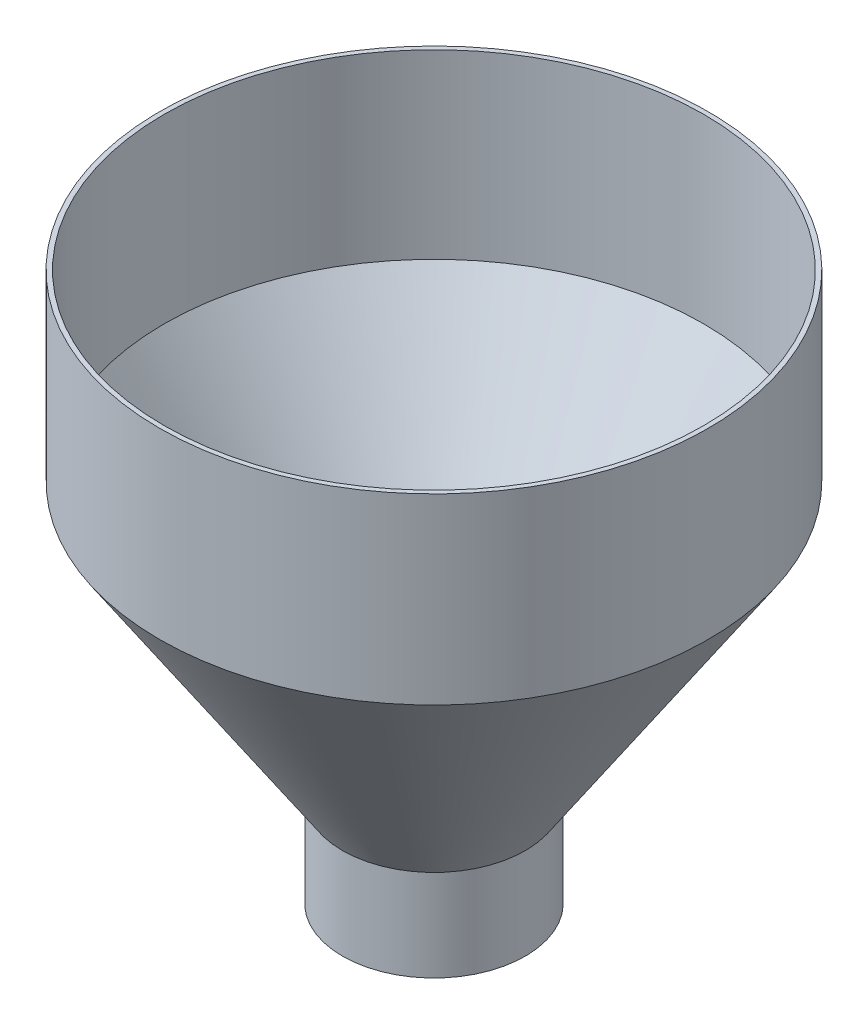
ISO-10303-21;
HEADER;
FILE_DESCRIPTION(('STEP AP214'),'2;1');
FILE_NAME('part.step','',(''),(''),'','','');
FILE_SCHEMA(('AUTOMOTIVE_DESIGN { 1 0 10303 214 1 1 1 1 }'));
ENDSEC;
DATA;
#1=APPLICATION_CONTEXT('core data for automotive mechanical design processes');
#2=APPLICATION_PROTOCOL_DEFINITION('international standard','automotive_design',2000,#1);
#3=PRODUCT_CONTEXT('',#1,'mechanical');
#4=PRODUCT('Part','Part','',(#3));
#5=PRODUCT_RELATED_PRODUCT_CATEGORY('part','',(#4));
#6=PRODUCT_DEFINITION_FORMATION('','',#4);
#7=PRODUCT_DEFINITION_CONTEXT('part definition',#1,'design');
#8=PRODUCT_DEFINITION('design','',#6,#7);
#9=PRODUCT_DEFINITION_SHAPE('','',#8);
#10=(LENGTH_UNIT() NAMED_UNIT(*) SI_UNIT(.MILLI.,.METRE.));
#11=(NAMED_UNIT(*) PLANE_ANGLE_UNIT() SI_UNIT($,.RADIAN.));
#12=(NAMED_UNIT(*) SI_UNIT($,.STERADIAN.) SOLID_ANGLE_UNIT());
#13=UNCERTAINTY_MEASURE_WITH_UNIT(LENGTH_MEASURE(1.E-05),#10,'distance_accuracy_value','');
#14=(GEOMETRIC_REPRESENTATION_CONTEXT(3) GLOBAL_UNCERTAINTY_ASSIGNED_CONTEXT((#13)) GLOBAL_UNIT_ASSIGNED_CONTEXT((#10,
#11,#12)) REPRESENTATION_CONTEXT('',''));
#15=CARTESIAN_POINT('',(0.,0.,0.));
#16=DIRECTION('',(0.,0.,1.));
#17=DIRECTION('',(1.,0.,0.));
#18=AXIS2_PLACEMENT_3D('',#15,#16,#17);
#19=CARTESIAN_POINT('',(0.,240.,0.));
#20=DIRECTION('',(0.,1.,0.));
#21=DIRECTION('',(0.,0.,1.));
#22=AXIS2_PLACEMENT_3D('',#19,#20,#21);
#23=PLANE('',#22);
#24=CARTESIAN_POINT('',(0.,240.,0.));
#25=DIRECTION('',(0.,1.,0.));
#26=DIRECTION('',(0.,0.,1.));
#27=AXIS2_PLACEMENT_3D('',#24,#25,#26);
#28=CIRCLE('',#27,118.);
#29=CARTESIAN_POINT('',(0.,240.,118.));
#30=VERTEX_POINT('',#29);
#31=EDGE_CURVE('E56',#30,#30,#28,.T.);
#32=ORIENTED_EDGE('',*,*,#31,.F.);
#33=EDGE_LOOP('',(#32));
#34=FACE_BOUND('',#33,.T.);
#35=CARTESIAN_POINT('',(0.,240.,0.));
#36=DIRECTION('',(0.,1.,0.));
#37=DIRECTION('',(0.,0.,1.));
#38=AXIS2_PLACEMENT_3D('',#35,#36,#37);
#39=CIRCLE('',#38,120.);
#40=CARTESIAN_POINT('',(0.,240.,120.));
#41=VERTEX_POINT('',#40);
#42=EDGE_CURVE('E10',#41,#41,#39,.T.);
#43=ORIENTED_EDGE('',*,*,#42,.T.);
#44=EDGE_LOOP('',(#43));
#45=FACE_BOUND('',#44,.T.);
#46=ADVANCED_FACE('F37',(#34,#45),#23,.T.);
#47=CARTESIAN_POINT('',(0.,249.803796798176,0.));
#48=DIRECTION('',(0.,1.,0.));
#49=DIRECTION('',(0.,0.,1.));
#50=AXIS2_PLACEMENT_3D('',#47,#48,#49);
#51=CYLINDRICAL_SURFACE('',#50,120.);
#52=ORIENTED_EDGE('',*,*,#42,.F.);
#53=EDGE_LOOP('',(#52));
#54=FACE_BOUND('',#53,.T.);
#55=CARTESIAN_POINT('',(0.,160.,0.));
#56=DIRECTION('',(0.,1.,0.));
#57=DIRECTION('',(0.,0.,1.));
#58=AXIS2_PLACEMENT_3D('',#55,#56,#57);
#59=CIRCLE('',#58,120.);
#60=CARTESIAN_POINT('',(0.,160.,120.));
#61=VERTEX_POINT('',#60);
#62=EDGE_CURVE('E43',#61,#61,#59,.T.);
#63=ORIENTED_EDGE('',*,*,#62,.T.);
#64=EDGE_LOOP('',(#63));
#65=FACE_BOUND('',#64,.T.);
#66=ADVANCED_FACE('F87',(#54,#65),#51,.T.);
#67=CARTESIAN_POINT('',(0.,160.,0.));
#68=DIRECTION('',(0.,1.,0.));
#69=DIRECTION('',(0.,0.,1.));
#70=AXIS2_PLACEMENT_3D('',#67,#68,#69);
#71=CONICAL_SURFACE('',#70,120.,0.588002603547568);
#72=CARTESIAN_POINT('',(0.,40.,0.));
#73=DIRECTION('',(0.,1.,0.));
#74=DIRECTION('',(0.,0.,1.));
#75=AXIS2_PLACEMENT_3D('',#72,#73,#74);
#76=CIRCLE('',#75,40.);
#77=CARTESIAN_POINT('',(0.,40.,40.));
#78=VERTEX_POINT('',#77);
#79=EDGE_CURVE('E47',#78,#78,#76,.T.);
#80=CARTESIAN_POINT('',(0.,40.,40.));
#81=CARTESIAN_POINT('',(0.,41.25,40.8333333333333));
#82=CARTESIAN_POINT('',(0.,42.5,41.6666666666667));
#83=CARTESIAN_POINT('',(0.,45.,43.3333333333333));
#84=CARTESIAN_POINT('',(0.,46.25,44.1666666666666));
#85=CARTESIAN_POINT('',(0.,48.75,45.8333333333333));
#86=CARTESIAN_POINT('',(0.,50.,46.6666666666666));
#87=CARTESIAN_POINT('',(0.,52.5,48.3333333333333));
#88=CARTESIAN_POINT('',(0.,53.75,49.1666666666666));
#89=CARTESIAN_POINT('',(0.,56.25,50.8333333333333));
#90=CARTESIAN_POINT('',(0.,57.5,51.6666666666666));
#91=CARTESIAN_POINT('',(0.,60.,53.3333333333333));
#92=CARTESIAN_POINT('',(0.,61.25,54.1666666666666));
#93=CARTESIAN_POINT('',(0.,63.75,55.8333333333333));
#94=CARTESIAN_POINT('',(0.,65.,56.6666666666666));
#95=CARTESIAN_POINT('',(0.,67.5,58.3333333333333));
#96=CARTESIAN_POINT('',(0.,68.7499999999999,59.1666666666666));
#97=CARTESIAN_POINT('',(0.,71.25,60.8333333333333));
#98=CARTESIAN_POINT('',(0.,72.5,61.6666666666666));
#99=CARTESIAN_POINT('',(0.,75.,63.3333333333333));
#100=CARTESIAN_POINT('',(0.,76.25,64.1666666666666));
#101=CARTESIAN_POINT('',(0.,78.75,65.8333333333333));
#102=CARTESIAN_POINT('',(0.,79.9999999999999,66.6666666666666));
#103=CARTESIAN_POINT('',(0.,82.4999999999999,68.3333333333333));
#104=CARTESIAN_POINT('',(0.,83.7499999999999,69.1666666666666));
#105=CARTESIAN_POINT('',(0.,86.2499999999999,70.8333333333333));
#106=CARTESIAN_POINT('',(0.,87.4999999999999,71.6666666666666));
#107=CARTESIAN_POINT('',(0.,89.9999999999999,73.3333333333333));
#108=CARTESIAN_POINT('',(0.,91.2499999999999,74.1666666666666));
#109=CARTESIAN_POINT('',(0.,93.7499999999999,75.8333333333333));
#110=CARTESIAN_POINT('',(0.,94.9999999999999,76.6666666666666));
#111=CARTESIAN_POINT('',(0.,97.4999999999999,78.3333333333333));
#112=CARTESIAN_POINT('',(0.,98.7499999999999,79.1666666666666));
#113=CARTESIAN_POINT('',(0.,101.25,80.8333333333333));
#114=CARTESIAN_POINT('',(0.,102.5,81.6666666666666));
#115=CARTESIAN_POINT('',(0.,105.,83.3333333333333));
#116=CARTESIAN_POINT('',(0.,106.25,84.1666666666666));
#117=CARTESIAN_POINT('',(0.,108.75,85.8333333333333));
#118=CARTESIAN_POINT('',(0.,110.,86.6666666666666));
#119=CARTESIAN_POINT('',(0.,112.5,88.3333333333333));
#120=CARTESIAN_POINT('',(0.,113.75,89.1666666666666));
#121=CARTESIAN_POINT('',(0.,116.25,90.8333333333333));
#122=CARTESIAN_POINT('',(0.,117.5,91.6666666666666));
#123=CARTESIAN_POINT('',(0.,120.,93.3333333333333));
#124=CARTESIAN_POINT('',(0.,121.25,94.1666666666666));
#125=CARTESIAN_POINT('',(0.,123.75,95.8333333333333));
#126=CARTESIAN_POINT('',(0.,125.,96.6666666666666));
#127=CARTESIAN_POINT('',(0.,127.5,98.3333333333333));
#128=CARTESIAN_POINT('',(0.,128.75,99.1666666666666));
#129=CARTESIAN_POINT('',(0.,131.25,100.833333333333));
#130=CARTESIAN_POINT('',(0.,132.5,101.666666666667));
#131=CARTESIAN_POINT('',(0.,135.,103.333333333333));
#132=CARTESIAN_POINT('',(0.,136.25,104.166666666667));
#133=CARTESIAN_POINT('',(0.,138.75,105.833333333333));
#134=CARTESIAN_POINT('',(0.,140.,106.666666666667));
#135=CARTESIAN_POINT('',(0.,142.5,108.333333333333));
#136=CARTESIAN_POINT('',(0.,143.75,109.166666666667));
#137=CARTESIAN_POINT('',(0.,146.25,110.833333333333));
#138=CARTESIAN_POINT('',(0.,147.5,111.666666666667));
#139=CARTESIAN_POINT('',(0.,150.,113.333333333333));
#140=CARTESIAN_POINT('',(0.,151.25,114.166666666667));
#141=CARTESIAN_POINT('',(0.,153.75,115.833333333333));
#142=CARTESIAN_POINT('',(0.,155.,116.666666666667));
#143=CARTESIAN_POINT('',(0.,157.5,118.333333333333));
#144=CARTESIAN_POINT('',(0.,158.75,119.166666666667));
#145=CARTESIAN_POINT('',(0.,160.,120.));
#146=B_SPLINE_CURVE_WITH_KNOTS('',3,(#80,#81,#82,#83,#84,#85,#86,#87,#88,#89,#90,#91,#92,#93,
#94,#95,#96,#97,#98,#99,#100,#101,#102,#103,#104,#105,#106,#107,#108,#109,#110,#111,#112,#113,
#114,#115,#116,#117,#118,#119,#120,#121,#122,#123,#124,#125,#126,#127,#128,#129,#130,#131,#132,
#133,#134,#135,#136,#137,#138,#139,#140,#141,#142,#143,#144,#145),.UNSPECIFIED.,.F.,.F.,(4,2,2,
2,2,2,2,2,2,2,2,2,2,2,2,2,2,2,2,2,2,2,2,2,2,2,2,2,2,2,2,2,4),(0.,4.50693909432999,
9.01387818865996,13.52081728299,18.0277563773199,22.5346954716499,27.0416345659799,
31.5485736603099,36.0555127546399,40.5624518489699,45.0693909432998,49.5763300376298,
54.0832691319598,58.5902082262898,63.0971473206198,67.6040864149497,72.1110255092797,
76.6179646036097,81.1249036979397,85.6318427922697,90.1387818865997,94.6457209809296,
99.1526600752596,103.65959916959,108.16653826392,112.67347735825,117.18041645258,
121.68735554691,126.19429464124,130.70123373557,135.2081728299,139.715111924229,
144.222051018559),.UNSPECIFIED.);
#147=EDGE_CURVE('BSEAM92',#78,#61,#146,.T.);
#148=ORIENTED_EDGE('',*,*,#79,.T.);
#149=ORIENTED_EDGE('',*,*,#62,.F.);
#150=ORIENTED_EDGE('',*,*,#147,.T.);
#151=ORIENTED_EDGE('',*,*,#147,.F.);
#152=EDGE_LOOP('',(#148,#150,#149,#151));
#153=FACE_BOUND('',#152,.T.);
#154=ADVANCED_FACE('F92',(#153),#71,.T.);
#155=CARTESIAN_POINT('',(0.,249.803796798176,0.));
#156=DIRECTION('',(0.,1.,0.));
#157=DIRECTION('',(0.,0.,1.));
#158=AXIS2_PLACEMENT_3D('',#155,#156,#157);
#159=CYLINDRICAL_SURFACE('',#158,40.);
#160=ORIENTED_EDGE('',*,*,#79,.F.);
#161=EDGE_LOOP('',(#160));
#162=FACE_BOUND('',#161,.T.);
#163=CARTESIAN_POINT('',(0.,0.,0.));
#164=DIRECTION('',(0.,1.,0.));
#165=DIRECTION('',(0.,0.,1.));
#166=AXIS2_PLACEMENT_3D('',#163,#164,#165);
#167=CIRCLE('',#166,40.);
#168=CARTESIAN_POINT('',(0.,0.,40.));
#169=VERTEX_POINT('',#168);
#170=EDGE_CURVE('E51',#169,#169,#167,.T.);
#171=ORIENTED_EDGE('',*,*,#170,.T.);
#172=EDGE_LOOP('',(#171));
#173=FACE_BOUND('',#172,.T.);
#174=ADVANCED_FACE('F83',(#162,#173),#159,.T.);
#175=CARTESIAN_POINT('',(0.,0.,0.));
#176=DIRECTION('',(0.,1.,0.));
#177=DIRECTION('',(0.,0.,1.));
#178=AXIS2_PLACEMENT_3D('',#175,#176,#177);
#179=PLANE('',#178);
#180=CARTESIAN_POINT('',(0.,0.,0.));
#181=DIRECTION('',(0.,1.,0.));
#182=DIRECTION('',(0.,0.,1.));
#183=AXIS2_PLACEMENT_3D('',#180,#181,#182);
#184=CIRCLE('',#183,38.);
#185=CARTESIAN_POINT('',(0.,0.,38.));
#186=VERTEX_POINT('',#185);
#187=EDGE_CURVE('E57',#186,#186,#184,.T.);
#188=ORIENTED_EDGE('',*,*,#187,.T.);
#189=EDGE_LOOP('',(#188));
#190=FACE_BOUND('',#189,.T.);
#191=ORIENTED_EDGE('',*,*,#170,.F.);
#192=EDGE_LOOP('',(#191));
#193=FACE_BOUND('',#192,.T.);
#194=ADVANCED_FACE('F73',(#190,#193),#179,.F.);
#195=CARTESIAN_POINT('',(0.,249.803796798176,0.));
#196=DIRECTION('',(0.,1.,0.));
#197=DIRECTION('',(0.,0.,1.));
#198=AXIS2_PLACEMENT_3D('',#195,#196,#197);
#199=CYLINDRICAL_SURFACE('',#198,118.);
#200=ORIENTED_EDGE('',*,*,#31,.T.);
#201=EDGE_LOOP('',(#200));
#202=FACE_BOUND('',#201,.T.);
#203=CARTESIAN_POINT('',(0.,160.605551275464,0.));
#204=DIRECTION('',(0.,1.,0.));
#205=DIRECTION('',(0.,0.,1.));
#206=AXIS2_PLACEMENT_3D('',#203,#204,#205);
#207=CIRCLE('',#206,118.);
#208=CARTESIAN_POINT('',(0.,160.605551275464,118.));
#209=VERTEX_POINT('',#208);
#210=EDGE_CURVE('E63',#209,#209,#207,.T.);
#211=ORIENTED_EDGE('',*,*,#210,.F.);
#212=EDGE_LOOP('',(#211));
#213=FACE_BOUND('',#212,.T.);
#214=ADVANCED_FACE('F71',(#202,#213),#199,.F.);
#215=CARTESIAN_POINT('',(0.,161.10940039245,0.));
#216=DIRECTION('',(0.,1.,0.));
#217=DIRECTION('',(0.,0.,1.));
#218=AXIS2_PLACEMENT_3D('',#215,#216,#217);
#219=CONICAL_SURFACE('',#218,118.335899411324,0.588002603547568);
#220=CARTESIAN_POINT('',(0.,40.605551275464,0.));
#221=DIRECTION('',(0.,1.,0.));
#222=DIRECTION('',(0.,0.,1.));
#223=AXIS2_PLACEMENT_3D('',#220,#221,#222);
#224=CIRCLE('',#223,38.);
#225=CARTESIAN_POINT('',(0.,40.605551275464,38.));
#226=VERTEX_POINT('',#225);
#227=EDGE_CURVE('E60',#226,#226,#224,.T.);
#228=CARTESIAN_POINT('',(0.,40.605551275464,38.));
#229=CARTESIAN_POINT('',(0.,41.855551275464,38.8333333333333));
#230=CARTESIAN_POINT('',(0.,43.105551275464,39.6666666666667));
#231=CARTESIAN_POINT('',(0.,45.605551275464,41.3333333333333));
#232=CARTESIAN_POINT('',(0.,46.855551275464,42.1666666666667));
#233=CARTESIAN_POINT('',(0.,49.355551275464,43.8333333333333));
#234=CARTESIAN_POINT('',(0.,50.605551275464,44.6666666666667));
#235=CARTESIAN_POINT('',(0.,53.105551275464,46.3333333333333));
#236=CARTESIAN_POINT('',(0.,54.355551275464,47.1666666666667));
#237=CARTESIAN_POINT('',(0.,56.855551275464,48.8333333333333));
#238=CARTESIAN_POINT('',(0.,58.105551275464,49.6666666666667));
#239=CARTESIAN_POINT('',(0.,60.605551275464,51.3333333333333));
#240=CARTESIAN_POINT('',(0.,61.855551275464,52.1666666666667));
#241=CARTESIAN_POINT('',(0.,64.355551275464,53.8333333333333));
#242=CARTESIAN_POINT('',(0.,65.605551275464,54.6666666666667));
#243=CARTESIAN_POINT('',(0.,68.105551275464,56.3333333333333));
#244=CARTESIAN_POINT('',(0.,69.355551275464,57.1666666666667));
#245=CARTESIAN_POINT('',(0.,71.855551275464,58.8333333333333));
#246=CARTESIAN_POINT('',(0.,73.105551275464,59.6666666666667));
#247=CARTESIAN_POINT('',(0.,75.605551275464,61.3333333333333));
#248=CARTESIAN_POINT('',(0.,76.855551275464,62.1666666666667));
#249=CARTESIAN_POINT('',(0.,79.355551275464,63.8333333333333));
#250=CARTESIAN_POINT('',(0.,80.605551275464,64.6666666666667));
#251=CARTESIAN_POINT('',(0.,83.105551275464,66.3333333333333));
#252=CARTESIAN_POINT('',(0.,84.355551275464,67.1666666666667));
#253=CARTESIAN_POINT('',(0.,86.855551275464,68.8333333333333));
#254=CARTESIAN_POINT('',(0.,88.105551275464,69.6666666666667));
#255=CARTESIAN_POINT('',(0.,90.605551275464,71.3333333333333));
#256=CARTESIAN_POINT('',(0.,91.855551275464,72.1666666666666));
#257=CARTESIAN_POINT('',(0.,94.355551275464,73.8333333333333));
#258=CARTESIAN_POINT('',(0.,95.605551275464,74.6666666666666));
#259=CARTESIAN_POINT('',(0.,98.105551275464,76.3333333333333));
#260=CARTESIAN_POINT('',(0.,99.355551275464,77.1666666666666));
#261=CARTESIAN_POINT('',(0.,101.855551275464,78.8333333333333));
#262=CARTESIAN_POINT('',(0.,103.105551275464,79.6666666666666));
#263=CARTESIAN_POINT('',(0.,105.605551275464,81.3333333333333));
#264=CARTESIAN_POINT('',(0.,106.855551275464,82.1666666666667));
#265=CARTESIAN_POINT('',(0.,109.355551275464,83.8333333333333));
#266=CARTESIAN_POINT('',(0.,110.605551275464,84.6666666666666));
#267=CARTESIAN_POINT('',(0.,113.105551275464,86.3333333333333));
#268=CARTESIAN_POINT('',(0.,114.355551275464,87.1666666666666));
#269=CARTESIAN_POINT('',(0.,116.855551275464,88.8333333333333));
#270=CARTESIAN_POINT('',(0.,118.105551275464,89.6666666666666));
#271=CARTESIAN_POINT('',(0.,120.605551275464,91.3333333333333));
#272=CARTESIAN_POINT('',(0.,121.855551275464,92.1666666666666));
#273=CARTESIAN_POINT('',(0.,124.355551275464,93.8333333333333));
#274=CARTESIAN_POINT('',(0.,125.605551275464,94.6666666666666));
#275=CARTESIAN_POINT('',(0.,128.105551275464,96.3333333333333));
#276=CARTESIAN_POINT('',(0.,129.355551275464,97.1666666666667));
#277=CARTESIAN_POINT('',(0.,131.855551275464,98.8333333333333));
#278=CARTESIAN_POINT('',(0.,133.105551275464,99.6666666666666));
#279=CARTESIAN_POINT('',(0.,135.605551275464,101.333333333333));
#280=CARTESIAN_POINT('',(0.,136.855551275464,102.166666666667));
#281=CARTESIAN_POINT('',(0.,139.355551275464,103.833333333333));
#282=CARTESIAN_POINT('',(0.,140.605551275464,104.666666666667));
#283=CARTESIAN_POINT('',(0.,143.105551275464,106.333333333333));
#284=CARTESIAN_POINT('',(0.,144.355551275464,107.166666666667));
#285=CARTESIAN_POINT('',(0.,146.855551275464,108.833333333333));
#286=CARTESIAN_POINT('',(0.,148.105551275464,109.666666666667));
#287=CARTESIAN_POINT('',(0.,150.605551275464,111.333333333333));
#288=CARTESIAN_POINT('',(0.,151.855551275464,112.166666666667));
#289=CARTESIAN_POINT('',(0.,154.355551275464,113.833333333333));
#290=CARTESIAN_POINT('',(0.,155.605551275464,114.666666666667));
#291=CARTESIAN_POINT('',(0.,158.105551275464,116.333333333333));
#292=CARTESIAN_POINT('',(0.,159.355551275464,117.166666666667));
#293=CARTESIAN_POINT('',(0.,160.605551275464,118.));
#294=B_SPLINE_CURVE_WITH_KNOTS('',3,(#228,#229,#230,#231,#232,#233,#234,#235,#236,#237,#238,
#239,#240,#241,#242,#243,#244,#245,#246,#247,#248,#249,#250,#251,#252,#253,#254,#255,#256,#257,
#258,#259,#260,#261,#262,#263,#264,#265,#266,#267,#268,#269,#270,#271,#272,#273,#274,#275,#276,
#277,#278,#279,#280,#281,#282,#283,#284,#285,#286,#287,#288,#289,#290,#291,#292,#293),
.UNSPECIFIED.,.F.,.F.,(4,2,2,2,2,2,2,2,2,2,2,2,2,2,2,2,2,2,2,2,2,2,2,2,2,2,2,2,2,2,2,2,4),(0.,
4.50693909432997,9.01387818865996,13.5208172829899,18.0277563773199,22.5346954716499,
27.0416345659799,31.5485736603099,36.0555127546399,40.5624518489698,45.0693909432998,
49.5763300376298,54.0832691319598,58.5902082262898,63.0971473206197,67.6040864149497,
72.1110255092797,76.6179646036097,81.1249036979397,85.6318427922697,90.1387818865996,
94.6457209809296,99.1526600752596,103.65959916959,108.16653826392,112.67347735825,
117.18041645258,121.68735554691,126.19429464124,130.70123373557,135.208172829899,
139.715111924229,144.222051018559),.UNSPECIFIED.);
#295=EDGE_CURVE('BSEAM69',#226,#209,#294,.T.);
#296=ORIENTED_EDGE('',*,*,#227,.F.);
#297=ORIENTED_EDGE('',*,*,#210,.T.);
#298=ORIENTED_EDGE('',*,*,#295,.T.);
#299=ORIENTED_EDGE('',*,*,#295,.F.);
#300=EDGE_LOOP('',(#296,#298,#297,#299));
#301=FACE_BOUND('',#300,.T.);
#302=ADVANCED_FACE('F69',(#301),#219,.F.);
#303=CARTESIAN_POINT('',(0.,249.803796798176,0.));
#304=DIRECTION('',(0.,1.,0.));
#305=DIRECTION('',(0.,0.,1.));
#306=AXIS2_PLACEMENT_3D('',#303,#304,#305);
#307=CYLINDRICAL_SURFACE('',#306,38.);
#308=ORIENTED_EDGE('',*,*,#227,.T.);
#309=EDGE_LOOP('',(#308));
#310=FACE_BOUND('',#309,.T.);
#311=ORIENTED_EDGE('',*,*,#187,.F.);
#312=EDGE_LOOP('',(#311));
#313=FACE_BOUND('',#312,.T.);
#314=ADVANCED_FACE('F80',(#310,#313),#307,.F.);
#315=CLOSED_SHELL('',(#46,#66,#154,#174,#194,#214,#302,#314));
#316=MANIFOLD_SOLID_BREP('B2',#315);
#317=ADVANCED_BREP_SHAPE_REPRESENTATION('',(#18,#316),#14);
#318=SHAPE_DEFINITION_REPRESENTATION(#9,#317);
ENDSEC;
END-ISO-10303-21;
